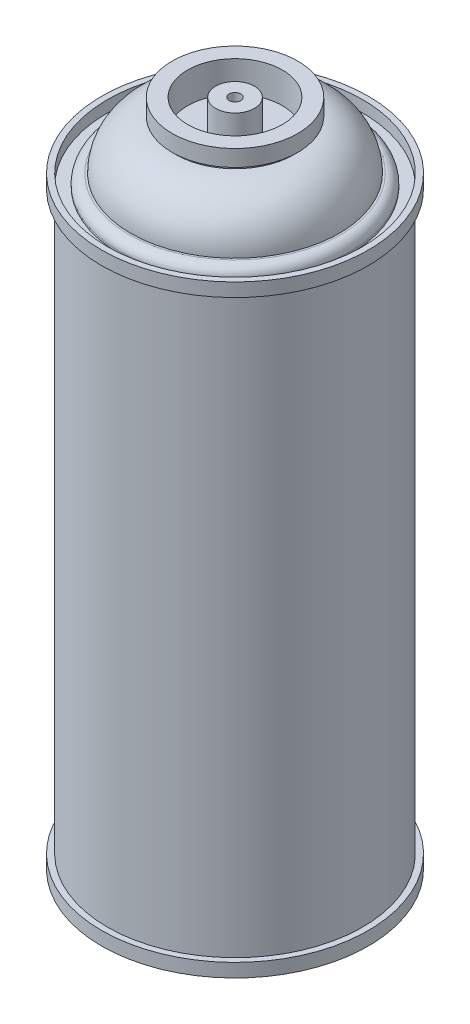
ISO-10303-21;
HEADER;
FILE_DESCRIPTION(('STEP AP214'),'2;1');
FILE_NAME('part.step','',(''),(''),'','','');
FILE_SCHEMA(('AUTOMOTIVE_DESIGN { 1 0 10303 214 1 1 1 1 }'));
ENDSEC;
DATA;
#1=APPLICATION_CONTEXT('core data for automotive mechanical design processes');
#2=APPLICATION_PROTOCOL_DEFINITION('international standard','automotive_design',2000,#1);
#3=PRODUCT_CONTEXT('',#1,'mechanical');
#4=PRODUCT('Part','Part','',(#3));
#5=PRODUCT_RELATED_PRODUCT_CATEGORY('part','',(#4));
#6=PRODUCT_DEFINITION_FORMATION('','',#4);
#7=PRODUCT_DEFINITION_CONTEXT('part definition',#1,'design');
#8=PRODUCT_DEFINITION('design','',#6,#7);
#9=PRODUCT_DEFINITION_SHAPE('','',#8);
#10=(LENGTH_UNIT() NAMED_UNIT(*) SI_UNIT(.MILLI.,.METRE.));
#11=(NAMED_UNIT(*) PLANE_ANGLE_UNIT() SI_UNIT($,.RADIAN.));
#12=(NAMED_UNIT(*) SI_UNIT($,.STERADIAN.) SOLID_ANGLE_UNIT());
#13=UNCERTAINTY_MEASURE_WITH_UNIT(LENGTH_MEASURE(1.E-05),#10,'distance_accuracy_value','');
#14=(GEOMETRIC_REPRESENTATION_CONTEXT(3) GLOBAL_UNCERTAINTY_ASSIGNED_CONTEXT((#13)) GLOBAL_UNIT_ASSIGNED_CONTEXT((#10,
#11,#12)) REPRESENTATION_CONTEXT('',''));
#15=CARTESIAN_POINT('',(0.,0.,0.));
#16=DIRECTION('',(0.,0.,1.));
#17=DIRECTION('',(1.,0.,0.));
#18=AXIS2_PLACEMENT_3D('',#15,#16,#17);
#19=CARTESIAN_POINT('',(0.,156.,0.));
#20=DIRECTION('',(0.,1.,0.));
#21=DIRECTION('',(0.,0.,1.));
#22=AXIS2_PLACEMENT_3D('',#19,#20,#21);
#23=PLANE('',#22);
#24=CARTESIAN_POINT('',(0.,156.,0.));
#25=DIRECTION('',(0.,1.,0.));
#26=DIRECTION('',(0.,0.,1.));
#27=AXIS2_PLACEMENT_3D('',#24,#25,#26);
#28=CIRCLE('',#27,27.5);
#29=CARTESIAN_POINT('',(0.,156.,27.5));
#30=VERTEX_POINT('',#29);
#31=EDGE_CURVE('E51',#30,#30,#28,.T.);
#32=ORIENTED_EDGE('',*,*,#31,.T.);
#33=EDGE_LOOP('',(#32));
#34=FACE_BOUND('',#33,.T.);
#35=CARTESIAN_POINT('',(0.,156.,0.));
#36=DIRECTION('',(0.,1.,0.));
#37=DIRECTION('',(0.,0.,1.));
#38=AXIS2_PLACEMENT_3D('',#35,#36,#37);
#39=CIRCLE('',#38,27.);
#40=CARTESIAN_POINT('',(0.,156.,27.));
#41=VERTEX_POINT('',#40);
#42=EDGE_CURVE('E101',#41,#41,#39,.T.);
#43=ORIENTED_EDGE('',*,*,#42,.F.);
#44=EDGE_LOOP('',(#43));
#45=FACE_BOUND('',#44,.T.);
#46=ADVANCED_FACE('F43',(#34,#45),#23,.T.);
#47=CARTESIAN_POINT('',(0.,156.,0.));
#48=DIRECTION('',(0.,1.,0.));
#49=DIRECTION('',(0.,0.,1.));
#50=AXIS2_PLACEMENT_3D('',#47,#48,#49);
#51=TOROIDAL_SURFACE('',#50,15.25,11.75);
#52=CARTESIAN_POINT('',(0.,167.75,0.));
#53=DIRECTION('',(0.,1.,0.));
#54=DIRECTION('',(0.,0.,1.));
#55=AXIS2_PLACEMENT_3D('',#52,#53,#54);
#56=CIRCLE('',#55,15.25);
#57=CARTESIAN_POINT('',(0.,167.75,15.25));
#58=VERTEX_POINT('',#57);
#59=EDGE_CURVE('E61',#58,#58,#56,.T.);
#60=ORIENTED_EDGE('',*,*,#59,.F.);
#61=EDGE_LOOP('',(#60));
#62=FACE_BOUND('',#61,.T.);
#63=ORIENTED_EDGE('',*,*,#42,.T.);
#64=EDGE_LOOP('',(#63));
#65=FACE_BOUND('',#64,.T.);
#66=ADVANCED_FACE('F178',(#62,#65),#51,.T.);
#67=CARTESIAN_POINT('',(0.,173.,0.));
#68=DIRECTION('',(0.,1.,0.));
#69=DIRECTION('',(0.,0.,1.));
#70=AXIS2_PLACEMENT_3D('',#67,#68,#69);
#71=CYLINDRICAL_SURFACE('',#70,15.25);
#72=CARTESIAN_POINT('',(0.,168.75,0.));
#73=DIRECTION('',(0.,1.,0.));
#74=DIRECTION('',(0.,0.,1.));
#75=AXIS2_PLACEMENT_3D('',#72,#73,#74);
#76=CIRCLE('',#75,15.25);
#77=CARTESIAN_POINT('',(0.,168.75,15.25));
#78=VERTEX_POINT('',#77);
#79=EDGE_CURVE('E73',#78,#78,#76,.T.);
#80=ORIENTED_EDGE('',*,*,#79,.F.);
#81=EDGE_LOOP('',(#80));
#82=FACE_BOUND('',#81,.T.);
#83=ORIENTED_EDGE('',*,*,#59,.T.);
#84=EDGE_LOOP('',(#83));
#85=FACE_BOUND('',#84,.T.);
#86=ADVANCED_FACE('F182',(#82,#85),#71,.T.);
#87=CARTESIAN_POINT('',(0.,168.75,-15.25));
#88=DIRECTION('',(0.,1.,0.));
#89=DIRECTION('',(0.,0.,1.));
#90=AXIS2_PLACEMENT_3D('',#87,#88,#89);
#91=PLANE('',#90);
#92=CARTESIAN_POINT('',(0.,168.75,0.));
#93=DIRECTION('',(0.,1.,0.));
#94=DIRECTION('',(0.,0.,1.));
#95=AXIS2_PLACEMENT_3D('',#92,#93,#94);
#96=CIRCLE('',#95,16.25);
#97=CARTESIAN_POINT('',(0.,168.75,16.25));
#98=VERTEX_POINT('',#97);
#99=EDGE_CURVE('E77',#98,#98,#96,.T.);
#100=ORIENTED_EDGE('',*,*,#99,.F.);
#101=EDGE_LOOP('',(#100));
#102=FACE_BOUND('',#101,.T.);
#103=ORIENTED_EDGE('',*,*,#79,.T.);
#104=EDGE_LOOP('',(#103));
#105=FACE_BOUND('',#104,.T.);
#106=ADVANCED_FACE('F328',(#102,#105),#91,.F.);
#107=CARTESIAN_POINT('',(0.,173.,0.));
#108=DIRECTION('',(0.,1.,0.));
#109=DIRECTION('',(0.,0.,1.));
#110=AXIS2_PLACEMENT_3D('',#107,#108,#109);
#111=CYLINDRICAL_SURFACE('',#110,16.25);
#112=CARTESIAN_POINT('',(0.,173.,0.));
#113=DIRECTION('',(0.,1.,0.));
#114=DIRECTION('',(0.,0.,1.));
#115=AXIS2_PLACEMENT_3D('',#112,#113,#114);
#116=CIRCLE('',#115,16.25);
#117=CARTESIAN_POINT('',(0.,173.,16.25));
#118=VERTEX_POINT('',#117);
#119=EDGE_CURVE('E81',#118,#118,#116,.T.);
#120=ORIENTED_EDGE('',*,*,#119,.F.);
#121=EDGE_LOOP('',(#120));
#122=FACE_BOUND('',#121,.T.);
#123=ORIENTED_EDGE('',*,*,#99,.T.);
#124=EDGE_LOOP('',(#123));
#125=FACE_BOUND('',#124,.T.);
#126=ADVANCED_FACE('F317',(#122,#125),#111,.T.);
#127=CARTESIAN_POINT('',(0.,173.,-16.25));
#128=DIRECTION('',(0.,-1.,0.));
#129=DIRECTION('',(0.,0.,-1.));
#130=AXIS2_PLACEMENT_3D('',#127,#128,#129);
#131=PLANE('',#130);
#132=CARTESIAN_POINT('',(0.,173.,0.));
#133=DIRECTION('',(0.,1.,0.));
#134=DIRECTION('',(0.,0.,1.));
#135=AXIS2_PLACEMENT_3D('',#132,#133,#134);
#136=CIRCLE('',#135,12.25);
#137=CARTESIAN_POINT('',(0.,173.,12.25));
#138=VERTEX_POINT('',#137);
#139=EDGE_CURVE('E85',#138,#138,#136,.T.);
#140=ORIENTED_EDGE('',*,*,#139,.F.);
#141=EDGE_LOOP('',(#140));
#142=FACE_BOUND('',#141,.T.);
#143=ORIENTED_EDGE('',*,*,#119,.T.);
#144=EDGE_LOOP('',(#143));
#145=FACE_BOUND('',#144,.T.);
#146=ADVANCED_FACE('F306',(#142,#145),#131,.F.);
#147=CARTESIAN_POINT('',(0.,173.,0.));
#148=DIRECTION('',(0.,1.,0.));
#149=DIRECTION('',(0.,0.,1.));
#150=AXIS2_PLACEMENT_3D('',#147,#148,#149);
#151=CYLINDRICAL_SURFACE('',#150,12.25);
#152=CARTESIAN_POINT('',(0.,165.,0.));
#153=DIRECTION('',(0.,1.,0.));
#154=DIRECTION('',(0.,0.,1.));
#155=AXIS2_PLACEMENT_3D('',#152,#153,#154);
#156=CIRCLE('',#155,12.25);
#157=CARTESIAN_POINT('',(0.,165.,12.25));
#158=VERTEX_POINT('',#157);
#159=EDGE_CURVE('E89',#158,#158,#156,.T.);
#160=ORIENTED_EDGE('',*,*,#159,.F.);
#161=EDGE_LOOP('',(#160));
#162=FACE_BOUND('',#161,.T.);
#163=ORIENTED_EDGE('',*,*,#139,.T.);
#164=EDGE_LOOP('',(#163));
#165=FACE_BOUND('',#164,.T.);
#166=ADVANCED_FACE('F295',(#162,#165),#151,.F.);
#167=CARTESIAN_POINT('',(0.,165.,-12.25));
#168=DIRECTION('',(0.,-1.,0.));
#169=DIRECTION('',(0.,0.,-1.));
#170=AXIS2_PLACEMENT_3D('',#167,#168,#169);
#171=PLANE('',#170);
#172=CARTESIAN_POINT('',(0.,165.,0.));
#173=DIRECTION('',(0.,1.,0.));
#174=DIRECTION('',(0.,0.,1.));
#175=AXIS2_PLACEMENT_3D('',#172,#173,#174);
#176=CIRCLE('',#175,5.);
#177=CARTESIAN_POINT('',(0.,165.,5.));
#178=VERTEX_POINT('',#177);
#179=EDGE_CURVE('E93',#178,#178,#176,.T.);
#180=ORIENTED_EDGE('',*,*,#179,.F.);
#181=EDGE_LOOP('',(#180));
#182=FACE_BOUND('',#181,.T.);
#183=ORIENTED_EDGE('',*,*,#159,.T.);
#184=EDGE_LOOP('',(#183));
#185=FACE_BOUND('',#184,.T.);
#186=ADVANCED_FACE('F282',(#182,#185),#171,.F.);
#187=CARTESIAN_POINT('',(0.,173.,0.));
#188=DIRECTION('',(0.,1.,0.));
#189=DIRECTION('',(0.,0.,1.));
#190=AXIS2_PLACEMENT_3D('',#187,#188,#189);
#191=CYLINDRICAL_SURFACE('',#190,5.);
#192=CARTESIAN_POINT('',(0.,173.,0.));
#193=DIRECTION('',(0.,1.,0.));
#194=DIRECTION('',(0.,0.,1.));
#195=AXIS2_PLACEMENT_3D('',#192,#193,#194);
#196=CIRCLE('',#195,5.);
#197=CARTESIAN_POINT('',(0.,173.,5.));
#198=VERTEX_POINT('',#197);
#199=EDGE_CURVE('E97',#198,#198,#196,.T.);
#200=ORIENTED_EDGE('',*,*,#199,.F.);
#201=EDGE_LOOP('',(#200));
#202=FACE_BOUND('',#201,.T.);
#203=ORIENTED_EDGE('',*,*,#179,.T.);
#204=EDGE_LOOP('',(#203));
#205=FACE_BOUND('',#204,.T.);
#206=ADVANCED_FACE('F277',(#202,#205),#191,.T.);
#207=CARTESIAN_POINT('',(0.,173.,-5.));
#208=DIRECTION('',(0.,-1.,0.));
#209=DIRECTION('',(0.,0.,-1.));
#210=AXIS2_PLACEMENT_3D('',#207,#208,#209);
#211=PLANE('',#210);
#212=CARTESIAN_POINT('',(0.,173.,0.));
#213=DIRECTION('',(0.,1.,0.));
#214=DIRECTION('',(0.,0.,1.));
#215=AXIS2_PLACEMENT_3D('',#212,#213,#214);
#216=CIRCLE('',#215,1.5);
#217=CARTESIAN_POINT('',(0.,173.,1.5));
#218=VERTEX_POINT('',#217);
#219=EDGE_CURVE('E124',#218,#218,#216,.T.);
#220=ORIENTED_EDGE('',*,*,#219,.F.);
#221=EDGE_LOOP('',(#220));
#222=FACE_BOUND('',#221,.T.);
#223=ORIENTED_EDGE('',*,*,#199,.T.);
#224=EDGE_LOOP('',(#223));
#225=FACE_BOUND('',#224,.T.);
#226=ADVANCED_FACE('F221',(#222,#225),#211,.F.);
#227=CARTESIAN_POINT('',(0.,167.,0.));
#228=DIRECTION('',(0.,1.,0.));
#229=DIRECTION('',(0.,0.,1.));
#230=AXIS2_PLACEMENT_3D('',#227,#228,#229);
#231=CYLINDRICAL_SURFACE('',#230,1.5);
#232=CARTESIAN_POINT('',(0.,167.,0.));
#233=DIRECTION('',(0.,1.,0.));
#234=DIRECTION('',(0.,0.,1.));
#235=AXIS2_PLACEMENT_3D('',#232,#233,#234);
#236=CIRCLE('',#235,1.5);
#237=CARTESIAN_POINT('',(0.,167.,1.5));
#238=VERTEX_POINT('',#237);
#239=EDGE_CURVE('E123',#238,#238,#236,.T.);
#240=ORIENTED_EDGE('',*,*,#239,.F.);
#241=EDGE_LOOP('',(#240));
#242=FACE_BOUND('',#241,.T.);
#243=ORIENTED_EDGE('',*,*,#219,.T.);
#244=EDGE_LOOP('',(#243));
#245=FACE_BOUND('',#244,.T.);
#246=ADVANCED_FACE('F218',(#242,#245),#231,.F.);
#247=CARTESIAN_POINT('',(0.,167.,0.));
#248=DIRECTION('',(0.,1.,0.));
#249=DIRECTION('',(0.,0.,1.));
#250=AXIS2_PLACEMENT_3D('',#247,#248,#249);
#251=PLANE('',#250);
#252=ORIENTED_EDGE('',*,*,#239,.T.);
#253=EDGE_LOOP('',(#252));
#254=FACE_BOUND('',#253,.T.);
#255=ADVANCED_FACE('F155',(#254),#251,.T.);
#256=CARTESIAN_POINT('',(0.,153.,0.));
#257=DIRECTION('',(0.,1.,0.));
#258=DIRECTION('',(0.,0.,1.));
#259=AXIS2_PLACEMENT_3D('',#256,#257,#258);
#260=CYLINDRICAL_SURFACE('',#259,33.);
#261=CARTESIAN_POINT('',(0.,153.,0.));
#262=DIRECTION('',(0.,1.,0.));
#263=DIRECTION('',(0.,0.,1.));
#264=AXIS2_PLACEMENT_3D('',#261,#262,#263);
#265=CIRCLE('',#264,33.);
#266=CARTESIAN_POINT('',(0.,153.,33.));
#267=VERTEX_POINT('',#266);
#268=EDGE_CURVE('E128',#267,#267,#265,.T.);
#269=ORIENTED_EDGE('',*,*,#268,.F.);
#270=EDGE_LOOP('',(#269));
#271=FACE_BOUND('',#270,.T.);
#272=CARTESIAN_POINT('',(0.,156.,0.));
#273=DIRECTION('',(0.,1.,0.));
#274=DIRECTION('',(0.,0.,1.));
#275=AXIS2_PLACEMENT_3D('',#272,#273,#274);
#276=CIRCLE('',#275,33.);
#277=CARTESIAN_POINT('',(0.,156.,33.));
#278=VERTEX_POINT('',#277);
#279=EDGE_CURVE('E132',#278,#278,#276,.T.);
#280=ORIENTED_EDGE('',*,*,#279,.T.);
#281=EDGE_LOOP('',(#280));
#282=FACE_BOUND('',#281,.T.);
#283=ADVANCED_FACE('F149',(#271,#282),#260,.F.);
#284=CARTESIAN_POINT('',(0.,153.,0.));
#285=DIRECTION('',(0.,1.,0.));
#286=DIRECTION('',(0.,0.,1.));
#287=AXIS2_PLACEMENT_3D('',#284,#285,#286);
#288=PLANE('',#287);
#289=CARTESIAN_POINT('',(0.,153.,0.));
#290=DIRECTION('',(0.,1.,0.));
#291=DIRECTION('',(0.,0.,1.));
#292=AXIS2_PLACEMENT_3D('',#289,#290,#291);
#293=CIRCLE('',#292,30.);
#294=CARTESIAN_POINT('',(0.,153.,30.));
#295=VERTEX_POINT('',#294);
#296=EDGE_CURVE('E136',#295,#295,#293,.T.);
#297=ORIENTED_EDGE('',*,*,#296,.F.);
#298=EDGE_LOOP('',(#297));
#299=FACE_BOUND('',#298,.T.);
#300=ORIENTED_EDGE('',*,*,#268,.T.);
#301=EDGE_LOOP('',(#300));
#302=FACE_BOUND('',#301,.T.);
#303=ADVANCED_FACE('F146',(#299,#302),#288,.T.);
#304=CARTESIAN_POINT('',(0.,153.,0.));
#305=DIRECTION('',(0.,1.,0.));
#306=DIRECTION('',(0.,0.,1.));
#307=AXIS2_PLACEMENT_3D('',#304,#305,#306);
#308=CYLINDRICAL_SURFACE('',#307,30.);
#309=CARTESIAN_POINT('',(0.,153.5,0.));
#310=DIRECTION('',(0.,1.,0.));
#311=DIRECTION('',(0.,0.,1.));
#312=AXIS2_PLACEMENT_3D('',#309,#310,#311);
#313=CIRCLE('',#312,30.);
#314=CARTESIAN_POINT('',(0.,153.5,30.));
#315=VERTEX_POINT('',#314);
#316=EDGE_CURVE('E10',#315,#315,#313,.F.);
#317=ORIENTED_EDGE('',*,*,#316,.T.);
#318=EDGE_LOOP('',(#317));
#319=FACE_BOUND('',#318,.T.);
#320=ORIENTED_EDGE('',*,*,#296,.T.);
#321=EDGE_LOOP('',(#320));
#322=FACE_BOUND('',#321,.T.);
#323=ADVANCED_FACE('F144',(#319,#322),#308,.T.);
#324=CARTESIAN_POINT('',(0.,-38.0104166666666,0.));
#325=DIRECTION('',(0.,1.,0.));
#326=DIRECTION('',(1.,0.,0.));
#327=AXIS2_PLACEMENT_3D('',#324,#325,#326);
#328=SPHERICAL_SURFACE('',#327,50.0104166666666);
#329=CARTESIAN_POINT('',(0.,0.,0.));
#330=DIRECTION('',(0.,1.,0.));
#331=DIRECTION('',(-1.,0.,0.));
#332=AXIS2_PLACEMENT_3D('',#329,#330,#331);
#333=CIRCLE('',#332,32.5);
#334=CARTESIAN_POINT('',(-32.5,0.,0.));
#335=VERTEX_POINT('',#334);
#336=EDGE_CURVE('E116',#335,#335,#333,.T.);
#337=ORIENTED_EDGE('',*,*,#336,.F.);
#338=EDGE_LOOP('',(#337));
#339=FACE_BOUND('',#338,.T.);
#340=ADVANCED_FACE('F191',(#339),#328,.F.);
#341=CARTESIAN_POINT('',(0.,0.,0.));
#342=DIRECTION('',(0.,1.,0.));
#343=DIRECTION('',(0.,0.,1.));
#344=AXIS2_PLACEMENT_3D('',#341,#342,#343);
#345=PLANE('',#344);
#346=ORIENTED_EDGE('',*,*,#336,.T.);
#347=EDGE_LOOP('',(#346));
#348=FACE_BOUND('',#347,.T.);
#349=CARTESIAN_POINT('',(0.,0.,0.));
#350=DIRECTION('',(0.,1.,0.));
#351=DIRECTION('',(0.,0.,1.));
#352=AXIS2_PLACEMENT_3D('',#349,#350,#351);
#353=CIRCLE('',#352,34.5);
#354=CARTESIAN_POINT('',(0.,0.,34.5));
#355=VERTEX_POINT('',#354);
#356=EDGE_CURVE('E68',#355,#355,#353,.T.);
#357=ORIENTED_EDGE('',*,*,#356,.F.);
#358=EDGE_LOOP('',(#357));
#359=FACE_BOUND('',#358,.T.);
#360=ADVANCED_FACE('F188',(#348,#359),#345,.F.);
#361=CARTESIAN_POINT('',(0.,0.,0.));
#362=DIRECTION('',(0.,1.,0.));
#363=DIRECTION('',(0.,0.,1.));
#364=AXIS2_PLACEMENT_3D('',#361,#362,#363);
#365=CYLINDRICAL_SURFACE('',#364,34.5);
#366=ORIENTED_EDGE('',*,*,#356,.T.);
#367=EDGE_LOOP('',(#366));
#368=FACE_BOUND('',#367,.T.);
#369=CARTESIAN_POINT('',(0.,3.5,0.));
#370=DIRECTION('',(0.,1.,0.));
#371=DIRECTION('',(0.,0.,1.));
#372=AXIS2_PLACEMENT_3D('',#369,#370,#371);
#373=CIRCLE('',#372,34.5);
#374=CARTESIAN_POINT('',(0.,3.5,34.5));
#375=VERTEX_POINT('',#374);
#376=EDGE_CURVE('E112',#375,#375,#373,.T.);
#377=ORIENTED_EDGE('',*,*,#376,.F.);
#378=EDGE_LOOP('',(#377));
#379=FACE_BOUND('',#378,.T.);
#380=ADVANCED_FACE('F190',(#368,#379),#365,.T.);
#381=CARTESIAN_POINT('',(0.,3.5,0.));
#382=DIRECTION('',(0.,1.,0.));
#383=DIRECTION('',(0.,0.,1.));
#384=AXIS2_PLACEMENT_3D('',#381,#382,#383);
#385=PLANE('',#384);
#386=CARTESIAN_POINT('',(0.,3.5,0.));
#387=DIRECTION('',(0.,1.,0.));
#388=DIRECTION('',(0.,0.,1.));
#389=AXIS2_PLACEMENT_3D('',#386,#387,#388);
#390=CIRCLE('',#389,33.);
#391=CARTESIAN_POINT('',(0.,3.5,33.));
#392=VERTEX_POINT('',#391);
#393=EDGE_CURVE('E64',#392,#392,#390,.T.);
#394=ORIENTED_EDGE('',*,*,#393,.F.);
#395=EDGE_LOOP('',(#394));
#396=FACE_BOUND('',#395,.T.);
#397=ORIENTED_EDGE('',*,*,#376,.T.);
#398=EDGE_LOOP('',(#397));
#399=FACE_BOUND('',#398,.T.);
#400=ADVANCED_FACE('F194',(#396,#399),#385,.T.);
#401=CARTESIAN_POINT('',(0.,156.,0.));
#402=DIRECTION('',(0.,-1.,0.));
#403=DIRECTION('',(0.,0.,-1.));
#404=AXIS2_PLACEMENT_3D('',#401,#402,#403);
#405=CYLINDRICAL_SURFACE('',#404,33.);
#406=ORIENTED_EDGE('',*,*,#393,.T.);
#407=EDGE_LOOP('',(#406));
#408=FACE_BOUND('',#407,.T.);
#409=CARTESIAN_POINT('',(0.,152.5,0.));
#410=DIRECTION('',(0.,1.,0.));
#411=DIRECTION('',(0.,0.,1.));
#412=AXIS2_PLACEMENT_3D('',#409,#410,#411);
#413=CIRCLE('',#412,33.);
#414=CARTESIAN_POINT('',(0.,152.5,33.));
#415=VERTEX_POINT('',#414);
#416=EDGE_CURVE('E56',#415,#415,#413,.T.);
#417=ORIENTED_EDGE('',*,*,#416,.F.);
#418=EDGE_LOOP('',(#417));
#419=FACE_BOUND('',#418,.T.);
#420=ADVANCED_FACE('F173',(#408,#419),#405,.T.);
#421=CARTESIAN_POINT('',(0.,152.5,0.));
#422=DIRECTION('',(0.,1.,0.));
#423=DIRECTION('',(0.,0.,1.));
#424=AXIS2_PLACEMENT_3D('',#421,#422,#423);
#425=PLANE('',#424);
#426=ORIENTED_EDGE('',*,*,#416,.T.);
#427=EDGE_LOOP('',(#426));
#428=FACE_BOUND('',#427,.T.);
#429=CARTESIAN_POINT('',(0.,152.5,0.));
#430=DIRECTION('',(0.,1.,0.));
#431=DIRECTION('',(0.,0.,1.));
#432=AXIS2_PLACEMENT_3D('',#429,#430,#431);
#433=CIRCLE('',#432,34.5);
#434=CARTESIAN_POINT('',(0.,152.5,34.5));
#435=VERTEX_POINT('',#434);
#436=EDGE_CURVE('E105',#435,#435,#433,.T.);
#437=ORIENTED_EDGE('',*,*,#436,.F.);
#438=EDGE_LOOP('',(#437));
#439=FACE_BOUND('',#438,.T.);
#440=ADVANCED_FACE('F167',(#428,#439),#425,.F.);
#441=CARTESIAN_POINT('',(0.,152.5,0.));
#442=DIRECTION('',(0.,1.,0.));
#443=DIRECTION('',(0.,0.,1.));
#444=AXIS2_PLACEMENT_3D('',#441,#442,#443);
#445=CYLINDRICAL_SURFACE('',#444,34.5);
#446=ORIENTED_EDGE('',*,*,#436,.T.);
#447=EDGE_LOOP('',(#446));
#448=FACE_BOUND('',#447,.T.);
#449=CARTESIAN_POINT('',(0.,156.,0.));
#450=DIRECTION('',(0.,1.,0.));
#451=DIRECTION('',(0.,0.,1.));
#452=AXIS2_PLACEMENT_3D('',#449,#450,#451);
#453=CIRCLE('',#452,34.5);
#454=CARTESIAN_POINT('',(0.,156.,34.5));
#455=VERTEX_POINT('',#454);
#456=EDGE_CURVE('E67',#455,#455,#453,.T.);
#457=ORIENTED_EDGE('',*,*,#456,.F.);
#458=EDGE_LOOP('',(#457));
#459=FACE_BOUND('',#458,.T.);
#460=ADVANCED_FACE('F162',(#448,#459),#445,.T.);
#461=ORIENTED_EDGE('',*,*,#279,.F.);
#462=EDGE_LOOP('',(#461));
#463=FACE_BOUND('',#462,.T.);
#464=ORIENTED_EDGE('',*,*,#456,.T.);
#465=EDGE_LOOP('',(#464));
#466=FACE_BOUND('',#465,.T.);
#467=ADVANCED_FACE('F159',(#463,#466),#23,.T.);
#468=CARTESIAN_POINT('',(0.,153.5,0.));
#469=DIRECTION('',(0.,1.,0.));
#470=DIRECTION('',(0.,0.,1.));
#471=AXIS2_PLACEMENT_3D('',#468,#469,#470);
#472=TOROIDAL_SURFACE('',#471,27.5,2.5);
#473=ORIENTED_EDGE('',*,*,#316,.F.);
#474=EDGE_LOOP('',(#473));
#475=FACE_BOUND('',#474,.T.);
#476=ORIENTED_EDGE('',*,*,#31,.F.);
#477=EDGE_LOOP('',(#476));
#478=FACE_BOUND('',#477,.T.);
#479=ADVANCED_FACE('F45',(#475,#478),#472,.T.);
#480=CLOSED_SHELL('',(#46,#66,#86,#106,#126,#146,#166,#186,#206,#226,#246,#255,#283,#303,#323,
#340,#360,#380,#400,#420,#440,#460,#467,#479));
#481=MANIFOLD_SOLID_BREP('B2',#480);
#482=ADVANCED_BREP_SHAPE_REPRESENTATION('',(#18,#481),#14);
#483=SHAPE_DEFINITION_REPRESENTATION(#9,#482);
ENDSEC;
END-ISO-10303-21;
